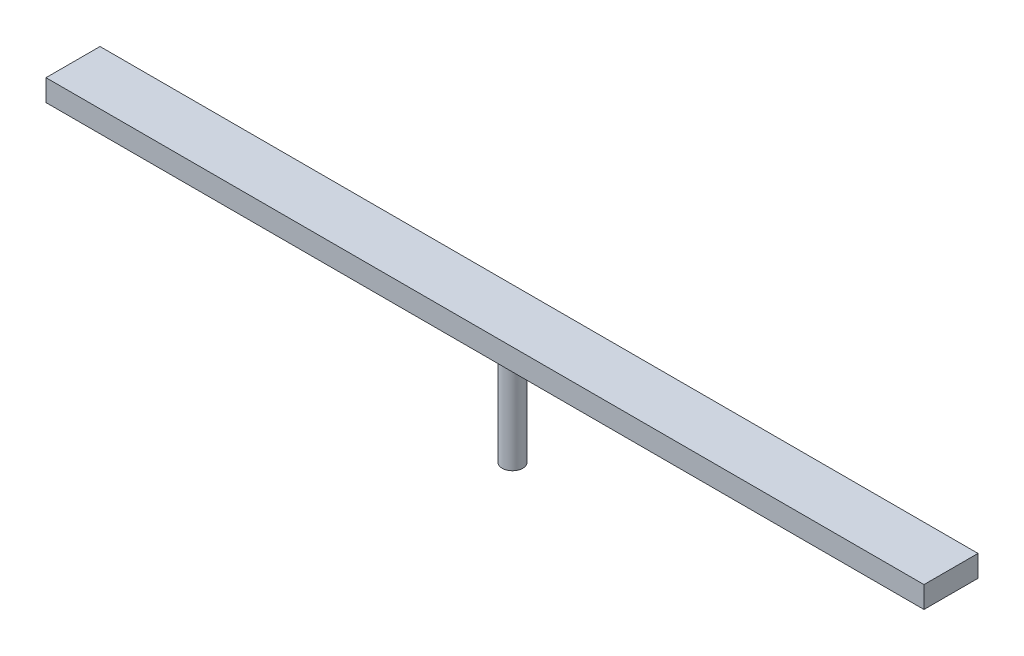
ISO-10303-21;
HEADER;
FILE_DESCRIPTION(('STEP AP214'),'2;1');
FILE_NAME('part.step','',(''),(''),'','','');
FILE_SCHEMA(('AUTOMOTIVE_DESIGN { 1 0 10303 214 1 1 1 1 }'));
ENDSEC;
DATA;
#1=APPLICATION_CONTEXT('core data for automotive mechanical design processes');
#2=APPLICATION_PROTOCOL_DEFINITION('international standard','automotive_design',2000,#1);
#3=PRODUCT_CONTEXT('',#1,'mechanical');
#4=PRODUCT('Part','Part','',(#3));
#5=PRODUCT_RELATED_PRODUCT_CATEGORY('part','',(#4));
#6=PRODUCT_DEFINITION_FORMATION('','',#4);
#7=PRODUCT_DEFINITION_CONTEXT('part definition',#1,'design');
#8=PRODUCT_DEFINITION('design','',#6,#7);
#9=PRODUCT_DEFINITION_SHAPE('','',#8);
#10=(LENGTH_UNIT() NAMED_UNIT(*) SI_UNIT(.MILLI.,.METRE.));
#11=(NAMED_UNIT(*) PLANE_ANGLE_UNIT() SI_UNIT($,.RADIAN.));
#12=(NAMED_UNIT(*) SI_UNIT($,.STERADIAN.) SOLID_ANGLE_UNIT());
#13=UNCERTAINTY_MEASURE_WITH_UNIT(LENGTH_MEASURE(1.E-05),#10,'distance_accuracy_value','');
#14=(GEOMETRIC_REPRESENTATION_CONTEXT(3) GLOBAL_UNCERTAINTY_ASSIGNED_CONTEXT((#13)) GLOBAL_UNIT_ASSIGNED_CONTEXT((#10,
#11,#12)) REPRESENTATION_CONTEXT('',''));
#15=CARTESIAN_POINT('',(0.,0.,0.));
#16=DIRECTION('',(0.,0.,1.));
#17=DIRECTION('',(1.,0.,0.));
#18=AXIS2_PLACEMENT_3D('',#15,#16,#17);
#19=CARTESIAN_POINT('',(0.,10.,25.));
#20=DIRECTION('',(1.,0.,0.));
#21=DIRECTION('',(0.,0.,-1.));
#22=AXIS2_PLACEMENT_3D('',#19,#20,#21);
#23=PLANE('',#22);
#24=DIRECTION('',(0.,-1.,0.));
#25=VECTOR('',#24,1.);
#26=CARTESIAN_POINT('',(0.,10.,0.));
#27=LINE('',#26,#25);
#28=CARTESIAN_POINT('',(0.,10.,0.));
#29=VERTEX_POINT('',#28);
#30=CARTESIAN_POINT('',(0.,0.,0.));
#31=VERTEX_POINT('',#30);
#32=EDGE_CURVE('E100',#29,#31,#27,.T.);
#33=ORIENTED_EDGE('',*,*,#32,.T.);
#34=DIRECTION('',(0.,0.,-1.));
#35=VECTOR('',#34,1.);
#36=CARTESIAN_POINT('',(0.,0.,25.));
#37=LINE('',#36,#35);
#38=CARTESIAN_POINT('',(0.,0.,25.));
#39=VERTEX_POINT('',#38);
#40=EDGE_CURVE('E42',#39,#31,#37,.T.);
#41=ORIENTED_EDGE('',*,*,#40,.F.);
#42=DIRECTION('',(0.,-1.,0.));
#43=VECTOR('',#42,1.);
#44=CARTESIAN_POINT('',(0.,10.,25.));
#45=LINE('',#44,#43);
#46=CARTESIAN_POINT('',(0.,10.,25.));
#47=VERTEX_POINT('',#46);
#48=EDGE_CURVE('E86',#47,#39,#45,.T.);
#49=ORIENTED_EDGE('',*,*,#48,.F.);
#50=DIRECTION('',(0.,0.,-1.));
#51=VECTOR('',#50,1.);
#52=CARTESIAN_POINT('',(0.,10.,25.));
#53=LINE('',#52,#51);
#54=EDGE_CURVE('E96',#47,#29,#53,.T.);
#55=ORIENTED_EDGE('',*,*,#54,.T.);
#56=EDGE_LOOP('',(#33,#41,#49,#55));
#57=FACE_BOUND('',#56,.T.);
#58=ADVANCED_FACE('F34',(#57),#23,.F.);
#59=CARTESIAN_POINT('',(0.,0.,25.));
#60=DIRECTION('',(0.,1.,0.));
#61=DIRECTION('',(0.,0.,1.));
#62=AXIS2_PLACEMENT_3D('',#59,#60,#61);
#63=PLANE('',#62);
#64=CARTESIAN_POINT('',(203.2,0.,12.25));
#65=DIRECTION('',(0.,1.,0.));
#66=DIRECTION('',(0.,0.,1.));
#67=AXIS2_PLACEMENT_3D('',#64,#65,#66);
#68=CIRCLE('',#67,4.75000000000001);
#69=CARTESIAN_POINT('',(203.2,0.,17.));
#70=VERTEX_POINT('',#69);
#71=EDGE_CURVE('E11',#70,#70,#68,.F.);
#72=ORIENTED_EDGE('',*,*,#71,.F.);
#73=EDGE_LOOP('',(#72));
#74=FACE_BOUND('',#73,.T.);
#75=DIRECTION('',(1.,0.,0.));
#76=VECTOR('',#75,1.);
#77=CARTESIAN_POINT('',(0.,0.,0.));
#78=LINE('',#77,#76);
#79=CARTESIAN_POINT('',(406.4,0.,0.));
#80=VERTEX_POINT('',#79);
#81=EDGE_CURVE('E91',#31,#80,#78,.T.);
#82=ORIENTED_EDGE('',*,*,#81,.T.);
#83=DIRECTION('',(0.,0.,-1.));
#84=VECTOR('',#83,1.);
#85=CARTESIAN_POINT('',(406.4,0.,25.));
#86=LINE('',#85,#84);
#87=CARTESIAN_POINT('',(406.4,0.,25.));
#88=VERTEX_POINT('',#87);
#89=EDGE_CURVE('E89',#88,#80,#86,.T.);
#90=ORIENTED_EDGE('',*,*,#89,.F.);
#91=DIRECTION('',(1.,0.,0.));
#92=VECTOR('',#91,1.);
#93=CARTESIAN_POINT('',(0.,0.,25.));
#94=LINE('',#93,#92);
#95=EDGE_CURVE('E81',#39,#88,#94,.T.);
#96=ORIENTED_EDGE('',*,*,#95,.F.);
#97=ORIENTED_EDGE('',*,*,#40,.T.);
#98=EDGE_LOOP('',(#82,#90,#96,#97));
#99=FACE_BOUND('',#98,.T.);
#100=ADVANCED_FACE('F90',(#74,#99),#63,.F.);
#101=CARTESIAN_POINT('',(406.4,0.,25.));
#102=DIRECTION('',(-1.,0.,0.));
#103=DIRECTION('',(0.,0.,1.));
#104=AXIS2_PLACEMENT_3D('',#101,#102,#103);
#105=PLANE('',#104);
#106=DIRECTION('',(0.,1.,0.));
#107=VECTOR('',#106,1.);
#108=CARTESIAN_POINT('',(406.4,0.,0.));
#109=LINE('',#108,#107);
#110=CARTESIAN_POINT('',(406.4,10.,0.));
#111=VERTEX_POINT('',#110);
#112=EDGE_CURVE('E67',#80,#111,#109,.T.);
#113=ORIENTED_EDGE('',*,*,#112,.T.);
#114=DIRECTION('',(0.,0.,-1.));
#115=VECTOR('',#114,1.);
#116=CARTESIAN_POINT('',(406.4,10.,25.));
#117=LINE('',#116,#115);
#118=CARTESIAN_POINT('',(406.4,10.,25.));
#119=VERTEX_POINT('',#118);
#120=EDGE_CURVE('E92',#119,#111,#117,.T.);
#121=ORIENTED_EDGE('',*,*,#120,.F.);
#122=DIRECTION('',(0.,1.,0.));
#123=VECTOR('',#122,1.);
#124=CARTESIAN_POINT('',(406.4,0.,25.));
#125=LINE('',#124,#123);
#126=EDGE_CURVE('E84',#88,#119,#125,.T.);
#127=ORIENTED_EDGE('',*,*,#126,.F.);
#128=ORIENTED_EDGE('',*,*,#89,.T.);
#129=EDGE_LOOP('',(#113,#121,#127,#128));
#130=FACE_BOUND('',#129,.T.);
#131=ADVANCED_FACE('F94',(#130),#105,.F.);
#132=CARTESIAN_POINT('',(406.4,10.,25.));
#133=DIRECTION('',(0.,-1.,0.));
#134=DIRECTION('',(1.,0.,0.));
#135=AXIS2_PLACEMENT_3D('',#132,#133,#134);
#136=PLANE('',#135);
#137=DIRECTION('',(-1.,0.,0.));
#138=VECTOR('',#137,1.);
#139=CARTESIAN_POINT('',(406.4,10.,0.));
#140=LINE('',#139,#138);
#141=EDGE_CURVE('E73',#111,#29,#140,.T.);
#142=ORIENTED_EDGE('',*,*,#141,.T.);
#143=ORIENTED_EDGE('',*,*,#54,.F.);
#144=DIRECTION('',(-1.,0.,0.));
#145=VECTOR('',#144,1.);
#146=CARTESIAN_POINT('',(406.4,10.,25.));
#147=LINE('',#146,#145);
#148=EDGE_CURVE('E50',#119,#47,#147,.T.);
#149=ORIENTED_EDGE('',*,*,#148,.F.);
#150=ORIENTED_EDGE('',*,*,#120,.T.);
#151=EDGE_LOOP('',(#142,#143,#149,#150));
#152=FACE_BOUND('',#151,.T.);
#153=ADVANCED_FACE('F122',(#152),#136,.F.);
#154=CARTESIAN_POINT('',(0.,0.,25.));
#155=DIRECTION('',(0.,0.,1.));
#156=DIRECTION('',(1.,0.,0.));
#157=AXIS2_PLACEMENT_3D('',#154,#155,#156);
#158=PLANE('',#157);
#159=ORIENTED_EDGE('',*,*,#48,.T.);
#160=ORIENTED_EDGE('',*,*,#95,.T.);
#161=ORIENTED_EDGE('',*,*,#126,.T.);
#162=ORIENTED_EDGE('',*,*,#148,.T.);
#163=EDGE_LOOP('',(#159,#160,#161,#162));
#164=FACE_BOUND('',#163,.T.);
#165=ADVANCED_FACE('F82',(#164),#158,.T.);
#166=CARTESIAN_POINT('',(0.,0.,0.));
#167=DIRECTION('',(0.,0.,1.));
#168=DIRECTION('',(1.,0.,0.));
#169=AXIS2_PLACEMENT_3D('',#166,#167,#168);
#170=PLANE('',#169);
#171=ORIENTED_EDGE('',*,*,#32,.F.);
#172=ORIENTED_EDGE('',*,*,#141,.F.);
#173=ORIENTED_EDGE('',*,*,#112,.F.);
#174=ORIENTED_EDGE('',*,*,#81,.F.);
#175=EDGE_LOOP('',(#171,#172,#173,#174));
#176=FACE_BOUND('',#175,.T.);
#177=ADVANCED_FACE('F111',(#176),#170,.F.);
#178=CARTESIAN_POINT('',(203.2,-49.,12.25));
#179=DIRECTION('',(0.,1.,0.));
#180=DIRECTION('',(0.,0.,1.));
#181=AXIS2_PLACEMENT_3D('',#178,#179,#180);
#182=CYLINDRICAL_SURFACE('',#181,4.75000000000001);
#183=CARTESIAN_POINT('',(203.2,-49.,12.25));
#184=DIRECTION('',(0.,-1.,0.));
#185=DIRECTION('',(0.,0.,-1.));
#186=AXIS2_PLACEMENT_3D('',#183,#184,#185);
#187=CIRCLE('',#186,4.75000000000001);
#188=CARTESIAN_POINT('',(203.2,-49.,7.5));
#189=VERTEX_POINT('',#188);
#190=EDGE_CURVE('E103',#189,#189,#187,.T.);
#191=ORIENTED_EDGE('',*,*,#190,.F.);
#192=EDGE_LOOP('',(#191));
#193=FACE_BOUND('',#192,.T.);
#194=ORIENTED_EDGE('',*,*,#71,.T.);
#195=EDGE_LOOP('',(#194));
#196=FACE_BOUND('',#195,.T.);
#197=ADVANCED_FACE('F113',(#193,#196),#182,.T.);
#198=CARTESIAN_POINT('',(203.2,-49.,12.25));
#199=DIRECTION('',(0.,-1.,0.));
#200=DIRECTION('',(0.,0.,-1.));
#201=AXIS2_PLACEMENT_3D('',#198,#199,#200);
#202=PLANE('',#201);
#203=ORIENTED_EDGE('',*,*,#190,.T.);
#204=EDGE_LOOP('',(#203));
#205=FACE_BOUND('',#204,.T.);
#206=ADVANCED_FACE('F119',(#205),#202,.T.);
#207=CLOSED_SHELL('',(#58,#100,#131,#153,#165,#177,#197,#206));
#208=MANIFOLD_SOLID_BREP('B2',#207);
#209=ADVANCED_BREP_SHAPE_REPRESENTATION('',(#18,#208),#14);
#210=SHAPE_DEFINITION_REPRESENTATION(#9,#209);
ENDSEC;
END-ISO-10303-21;
